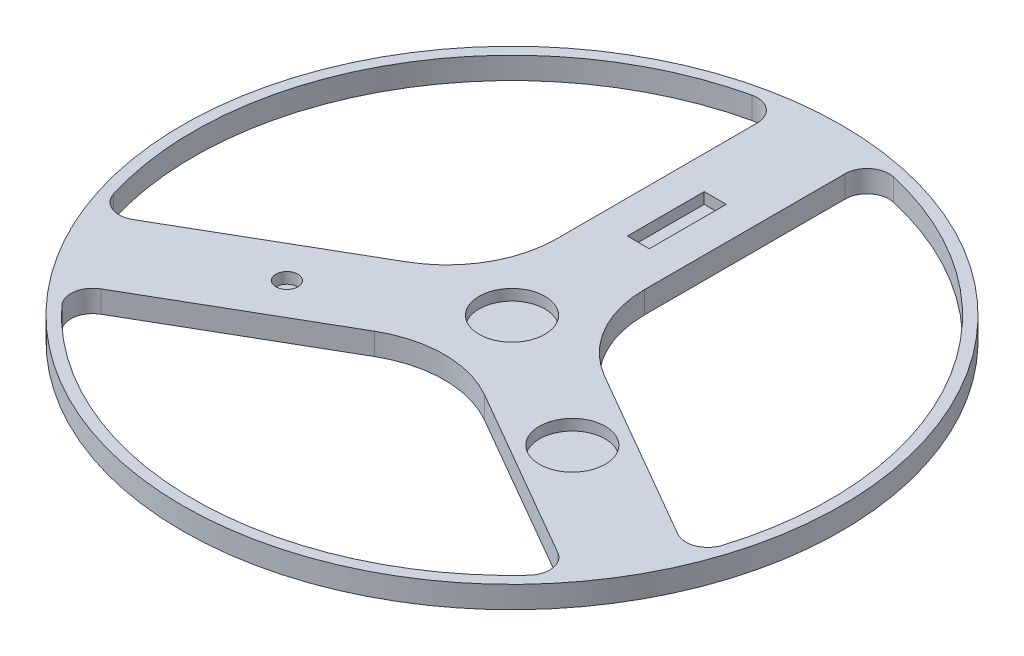
ISO-10303-21;
HEADER;
FILE_DESCRIPTION(('STEP AP214'),'2;1');
FILE_NAME('part.step','',(''),(''),'','','');
FILE_SCHEMA(('AUTOMOTIVE_DESIGN { 1 0 10303 214 1 1 1 1 }'));
ENDSEC;
DATA;
#1=APPLICATION_CONTEXT('core data for automotive mechanical design processes');
#2=APPLICATION_PROTOCOL_DEFINITION('international standard','automotive_design',2000,#1);
#3=PRODUCT_CONTEXT('',#1,'mechanical');
#4=PRODUCT('Part','Part','',(#3));
#5=PRODUCT_RELATED_PRODUCT_CATEGORY('part','',(#4));
#6=PRODUCT_DEFINITION_FORMATION('','',#4);
#7=PRODUCT_DEFINITION_CONTEXT('part definition',#1,'design');
#8=PRODUCT_DEFINITION('design','',#6,#7);
#9=PRODUCT_DEFINITION_SHAPE('','',#8);
#10=(LENGTH_UNIT() NAMED_UNIT(*) SI_UNIT(.MILLI.,.METRE.));
#11=(NAMED_UNIT(*) PLANE_ANGLE_UNIT() SI_UNIT($,.RADIAN.));
#12=(NAMED_UNIT(*) SI_UNIT($,.STERADIAN.) SOLID_ANGLE_UNIT());
#13=UNCERTAINTY_MEASURE_WITH_UNIT(LENGTH_MEASURE(1.E-05),#10,'distance_accuracy_value','');
#14=(GEOMETRIC_REPRESENTATION_CONTEXT(3) GLOBAL_UNCERTAINTY_ASSIGNED_CONTEXT((#13)) GLOBAL_UNIT_ASSIGNED_CONTEXT((#10,
#11,#12)) REPRESENTATION_CONTEXT('',''));
#15=CARTESIAN_POINT('',(0.,0.,0.));
#16=DIRECTION('',(0.,0.,1.));
#17=DIRECTION('',(1.,0.,0.));
#18=AXIS2_PLACEMENT_3D('',#15,#16,#17);
#19=CARTESIAN_POINT('',(-2.,2.,3.46410161513776));
#20=DIRECTION('',(-0.5,0.,0.866025403784439));
#21=DIRECTION('',(0.866025403784439,0.,0.5));
#22=AXIS2_PLACEMENT_3D('',#19,#20,#21);
#23=PLANE('',#22);
#24=DIRECTION('',(-0.866025403784439,0.,-0.5));
#25=VECTOR('',#24,1.);
#26=CARTESIAN_POINT('',(-2.,0.,3.46410161513776));
#27=LINE('',#26,#25);
#28=CARTESIAN_POINT('',(20.798026230356,0.,16.6265481962259));
#29=VERTEX_POINT('',#28);
#30=CARTESIAN_POINT('',(5.00000000000001,0.,7.50555349946514));
#31=VERTEX_POINT('',#30);
#32=EDGE_CURVE('E260',#29,#31,#27,.T.);
#33=ORIENTED_EDGE('',*,*,#32,.F.);
#34=DIRECTION('',(0.,1.,0.));
#35=VECTOR('',#34,1.);
#36=CARTESIAN_POINT('',(20.798026230356,2.,16.6265481962259));
#37=LINE('',#36,#35);
#38=CARTESIAN_POINT('',(20.798026230356,2.,16.6265481962259));
#39=VERTEX_POINT('',#38);
#40=EDGE_CURVE('E311',#29,#39,#37,.T.);
#41=ORIENTED_EDGE('',*,*,#40,.T.);
#42=DIRECTION('',(-0.866025403784439,0.,-0.5));
#43=VECTOR('',#42,1.);
#44=CARTESIAN_POINT('',(-2.,2.,3.46410161513776));
#45=LINE('',#44,#43);
#46=CARTESIAN_POINT('',(5.00000000000001,2.,7.50555349946514));
#47=VERTEX_POINT('',#46);
#48=EDGE_CURVE('E240',#39,#47,#45,.T.);
#49=ORIENTED_EDGE('',*,*,#48,.T.);
#50=DIRECTION('',(0.,-1.,0.));
#51=VECTOR('',#50,1.);
#52=CARTESIAN_POINT('',(5.00000000000001,2.,7.50555349946514));
#53=LINE('',#52,#51);
#54=EDGE_CURVE('E276',#47,#31,#53,.T.);
#55=ORIENTED_EDGE('',*,*,#54,.T.);
#56=EDGE_LOOP('',(#33,#41,#49,#55));
#57=FACE_BOUND('',#56,.T.);
#58=ADVANCED_FACE('F34',(#57),#23,.T.);
#59=CARTESIAN_POINT('',(0.,2.,0.));
#60=DIRECTION('',(0.,-1.,0.));
#61=DIRECTION('',(0.,0.,-1.));
#62=AXIS2_PLACEMENT_3D('',#59,#60,#61);
#63=CYLINDRICAL_SURFACE('',#62,29.);
#64=CARTESIAN_POINT('',(0.,2.,0.));
#65=DIRECTION('',(0.,1.,0.));
#66=DIRECTION('',(0.,0.,1.));
#67=AXIS2_PLACEMENT_3D('',#64,#65,#66);
#68=CIRCLE('',#67,29.);
#69=CARTESIAN_POINT('',(-21.2645466918638,2.,19.7184952262981));
#70=VERTEX_POINT('',#69);
#71=CARTESIAN_POINT('',(21.2645466918639,2.,19.7184952262981));
#72=VERTEX_POINT('',#71);
#73=EDGE_CURVE('E242',#70,#72,#68,.T.);
#74=ORIENTED_EDGE('',*,*,#73,.T.);
#75=DIRECTION('',(0.,-1.,0.));
#76=VECTOR('',#75,1.);
#77=CARTESIAN_POINT('',(21.2645466918639,2.,19.7184952262981));
#78=LINE('',#77,#76);
#79=CARTESIAN_POINT('',(21.2645466918639,0.,19.7184952262981));
#80=VERTEX_POINT('',#79);
#81=EDGE_CURVE('E308',#72,#80,#78,.T.);
#82=ORIENTED_EDGE('',*,*,#81,.T.);
#83=CARTESIAN_POINT('',(0.,0.,0.));
#84=DIRECTION('',(0.,1.,0.));
#85=DIRECTION('',(0.,0.,1.));
#86=AXIS2_PLACEMENT_3D('',#83,#84,#85);
#87=CIRCLE('',#86,29.);
#88=CARTESIAN_POINT('',(-21.2645466918638,0.,19.7184952262981));
#89=VERTEX_POINT('',#88);
#90=EDGE_CURVE('E262',#89,#80,#87,.T.);
#91=ORIENTED_EDGE('',*,*,#90,.F.);
#92=DIRECTION('',(0.,-1.,0.));
#93=VECTOR('',#92,1.);
#94=CARTESIAN_POINT('',(-21.2645466918638,2.,19.7184952262981));
#95=LINE('',#94,#93);
#96=EDGE_CURVE('E306',#89,#70,#95,.F.);
#97=ORIENTED_EDGE('',*,*,#96,.T.);
#98=EDGE_LOOP('',(#74,#82,#91,#97));
#99=FACE_BOUND('',#98,.T.);
#100=ADVANCED_FACE('F366',(#99),#63,.F.);
#101=CARTESIAN_POINT('',(-4.00000000000001,2.,0.));
#102=DIRECTION('',(1.,0.,0.));
#103=DIRECTION('',(0.,0.,-1.));
#104=AXIS2_PLACEMENT_3D('',#101,#102,#103);
#105=PLANE('',#104);
#106=DIRECTION('',(0.,0.,1.));
#107=VECTOR('',#106,1.);
#108=CARTESIAN_POINT('',(-4.00000000000001,2.,0.));
#109=LINE('',#108,#107);
#110=CARTESIAN_POINT('',(-4.,2.,-26.3248931621764));
#111=VERTEX_POINT('',#110);
#112=CARTESIAN_POINT('',(-4.,2.,-8.08290376865476));
#113=VERTEX_POINT('',#112);
#114=EDGE_CURVE('E243',#111,#113,#109,.T.);
#115=ORIENTED_EDGE('',*,*,#114,.F.);
#116=DIRECTION('',(0.,-1.,0.));
#117=VECTOR('',#116,1.);
#118=CARTESIAN_POINT('',(-4.,2.,-26.3248931621764));
#119=LINE('',#118,#117);
#120=CARTESIAN_POINT('',(-4.,0.,-26.3248931621764));
#121=VERTEX_POINT('',#120);
#122=EDGE_CURVE('E323',#111,#121,#119,.T.);
#123=ORIENTED_EDGE('',*,*,#122,.T.);
#124=DIRECTION('',(0.,0.,1.));
#125=VECTOR('',#124,1.);
#126=CARTESIAN_POINT('',(-4.00000000000001,0.,0.));
#127=LINE('',#126,#125);
#128=CARTESIAN_POINT('',(-4.,0.,-8.08290376865476));
#129=VERTEX_POINT('',#128);
#130=EDGE_CURVE('E263',#121,#129,#127,.T.);
#131=ORIENTED_EDGE('',*,*,#130,.T.);
#132=DIRECTION('',(0.,-1.,0.));
#133=VECTOR('',#132,1.);
#134=CARTESIAN_POINT('',(-4.,2.,-8.08290376865476));
#135=LINE('',#134,#133);
#136=EDGE_CURVE('E273',#129,#113,#135,.F.);
#137=ORIENTED_EDGE('',*,*,#136,.T.);
#138=EDGE_LOOP('',(#115,#123,#131,#137));
#139=FACE_BOUND('',#138,.T.);
#140=ADVANCED_FACE('F436',(#139),#105,.F.);
#141=CARTESIAN_POINT('',(-2.,2.,-3.46410161513776));
#142=DIRECTION('',(-0.500000000000001,0.,-0.866025403784438));
#143=DIRECTION('',(-0.866025403784438,0.,0.500000000000001));
#144=AXIS2_PLACEMENT_3D('',#141,#142,#143);
#145=PLANE('',#144);
#146=DIRECTION('',(0.866025403784438,0.,-0.500000000000001));
#147=VECTOR('',#146,1.);
#148=CARTESIAN_POINT('',(-2.,0.,-3.46410161513776));
#149=LINE('',#148,#147);
#150=CARTESIAN_POINT('',(-24.798026230356,0.,9.69834496595045));
#151=VERTEX_POINT('',#150);
#152=CARTESIAN_POINT('',(-9.,0.,0.577350269189626));
#153=VERTEX_POINT('',#152);
#154=EDGE_CURVE('E261',#151,#153,#149,.T.);
#155=ORIENTED_EDGE('',*,*,#154,.F.);
#156=DIRECTION('',(0.,1.,0.));
#157=VECTOR('',#156,1.);
#158=CARTESIAN_POINT('',(-24.798026230356,2.,9.69834496595044));
#159=LINE('',#158,#157);
#160=CARTESIAN_POINT('',(-24.798026230356,2.,9.69834496595045));
#161=VERTEX_POINT('',#160);
#162=EDGE_CURVE('E331',#151,#161,#159,.T.);
#163=ORIENTED_EDGE('',*,*,#162,.T.);
#164=DIRECTION('',(0.866025403784438,0.,-0.500000000000001));
#165=VECTOR('',#164,1.);
#166=CARTESIAN_POINT('',(-2.,2.,-3.46410161513776));
#167=LINE('',#166,#165);
#168=CARTESIAN_POINT('',(-9.,2.,0.577350269189626));
#169=VERTEX_POINT('',#168);
#170=EDGE_CURVE('E241',#161,#169,#167,.T.);
#171=ORIENTED_EDGE('',*,*,#170,.T.);
#172=DIRECTION('',(0.,-1.,0.));
#173=VECTOR('',#172,1.);
#174=CARTESIAN_POINT('',(-9.,2.,0.577350269189625));
#175=LINE('',#174,#173);
#176=EDGE_CURVE('E252',#169,#153,#175,.T.);
#177=ORIENTED_EDGE('',*,*,#176,.T.);
#178=EDGE_LOOP('',(#155,#163,#171,#177));
#179=FACE_BOUND('',#178,.T.);
#180=ADVANCED_FACE('F450',(#179),#145,.T.);
#181=CARTESIAN_POINT('',(2.,2.,-3.46410161513776));
#182=DIRECTION('',(-0.5,0.,0.866025403784439));
#183=DIRECTION('',(0.866025403784439,0.,0.5));
#184=AXIS2_PLACEMENT_3D('',#181,#182,#183);
#185=PLANE('',#184);
#186=DIRECTION('',(-0.866025403784439,0.,-0.5));
#187=VECTOR('',#186,1.);
#188=CARTESIAN_POINT('',(2.,2.,-3.46410161513776));
#189=LINE('',#188,#187);
#190=CARTESIAN_POINT('',(24.798026230356,2.,9.69834496595043));
#191=VERTEX_POINT('',#190);
#192=CARTESIAN_POINT('',(9.00000000000001,2.,0.577350269189624));
#193=VERTEX_POINT('',#192);
#194=EDGE_CURVE('E231',#191,#193,#189,.T.);
#195=ORIENTED_EDGE('',*,*,#194,.F.);
#196=DIRECTION('',(0.,-1.,0.));
#197=VECTOR('',#196,1.);
#198=CARTESIAN_POINT('',(24.798026230356,2.,9.69834496595042));
#199=LINE('',#198,#197);
#200=CARTESIAN_POINT('',(24.798026230356,0.,9.69834496595043));
#201=VERTEX_POINT('',#200);
#202=EDGE_CURVE('E313',#191,#201,#199,.T.);
#203=ORIENTED_EDGE('',*,*,#202,.T.);
#204=DIRECTION('',(-0.866025403784439,0.,-0.5));
#205=VECTOR('',#204,1.);
#206=CARTESIAN_POINT('',(2.,0.,-3.46410161513776));
#207=LINE('',#206,#205);
#208=CARTESIAN_POINT('',(9.00000000000001,0.,0.577350269189624));
#209=VERTEX_POINT('',#208);
#210=EDGE_CURVE('E226',#201,#209,#207,.T.);
#211=ORIENTED_EDGE('',*,*,#210,.T.);
#212=DIRECTION('',(0.,-1.,0.));
#213=VECTOR('',#212,1.);
#214=CARTESIAN_POINT('',(9.00000000000001,2.,0.577350269189622));
#215=LINE('',#214,#213);
#216=EDGE_CURVE('E285',#209,#193,#215,.F.);
#217=ORIENTED_EDGE('',*,*,#216,.T.);
#218=EDGE_LOOP('',(#195,#203,#211,#217));
#219=FACE_BOUND('',#218,.T.);
#220=ADVANCED_FACE('F414',(#219),#185,.F.);
#221=CARTESIAN_POINT('',(4.00000000000001,2.,0.));
#222=DIRECTION('',(1.,0.,0.));
#223=DIRECTION('',(0.,0.,-1.));
#224=AXIS2_PLACEMENT_3D('',#221,#222,#223);
#225=PLANE('',#224);
#226=DIRECTION('',(0.,0.,1.));
#227=VECTOR('',#226,1.);
#228=CARTESIAN_POINT('',(4.00000000000001,0.,0.));
#229=LINE('',#228,#227);
#230=CARTESIAN_POINT('',(4.,0.,-26.3248931621764));
#231=VERTEX_POINT('',#230);
#232=CARTESIAN_POINT('',(4.,0.,-8.08290376865476));
#233=VERTEX_POINT('',#232);
#234=EDGE_CURVE('E254',#231,#233,#229,.T.);
#235=ORIENTED_EDGE('',*,*,#234,.F.);
#236=DIRECTION('',(0.,1.,0.));
#237=VECTOR('',#236,1.);
#238=CARTESIAN_POINT('',(4.,2.,-26.3248931621764));
#239=LINE('',#238,#237);
#240=CARTESIAN_POINT('',(4.,2.,-26.3248931621764));
#241=VERTEX_POINT('',#240);
#242=EDGE_CURVE('E321',#231,#241,#239,.T.);
#243=ORIENTED_EDGE('',*,*,#242,.T.);
#244=DIRECTION('',(0.,0.,1.));
#245=VECTOR('',#244,1.);
#246=CARTESIAN_POINT('',(4.00000000000001,2.,0.));
#247=LINE('',#246,#245);
#248=CARTESIAN_POINT('',(4.,2.,-8.08290376865476));
#249=VERTEX_POINT('',#248);
#250=EDGE_CURVE('E233',#241,#249,#247,.T.);
#251=ORIENTED_EDGE('',*,*,#250,.T.);
#252=DIRECTION('',(0.,-1.,0.));
#253=VECTOR('',#252,1.);
#254=CARTESIAN_POINT('',(4.,2.,-8.08290376865476));
#255=LINE('',#254,#253);
#256=EDGE_CURVE('E282',#249,#233,#255,.T.);
#257=ORIENTED_EDGE('',*,*,#256,.T.);
#258=EDGE_LOOP('',(#235,#243,#251,#257));
#259=FACE_BOUND('',#258,.T.);
#260=ADVANCED_FACE('F405',(#259),#225,.T.);
#261=CARTESIAN_POINT('',(2.,2.,3.46410161513776));
#262=DIRECTION('',(-0.5,0.,-0.866025403784439));
#263=DIRECTION('',(-0.866025403784439,0.,0.5));
#264=AXIS2_PLACEMENT_3D('',#261,#262,#263);
#265=PLANE('',#264);
#266=DIRECTION('',(0.866025403784439,0.,-0.5));
#267=VECTOR('',#266,1.);
#268=CARTESIAN_POINT('',(2.,2.,3.46410161513776));
#269=LINE('',#268,#267);
#270=CARTESIAN_POINT('',(-20.798026230356,2.,16.626548196226));
#271=VERTEX_POINT('',#270);
#272=CARTESIAN_POINT('',(-4.99999999999999,2.,7.50555349946514));
#273=VERTEX_POINT('',#272);
#274=EDGE_CURVE('E247',#271,#273,#269,.T.);
#275=ORIENTED_EDGE('',*,*,#274,.F.);
#276=DIRECTION('',(0.,-1.,0.));
#277=VECTOR('',#276,1.);
#278=CARTESIAN_POINT('',(-20.798026230356,2.,16.626548196226));
#279=LINE('',#278,#277);
#280=CARTESIAN_POINT('',(-20.798026230356,0.,16.626548196226));
#281=VERTEX_POINT('',#280);
#282=EDGE_CURVE('E333',#271,#281,#279,.T.);
#283=ORIENTED_EDGE('',*,*,#282,.T.);
#284=DIRECTION('',(0.866025403784439,0.,-0.5));
#285=VECTOR('',#284,1.);
#286=CARTESIAN_POINT('',(2.,0.,3.46410161513776));
#287=LINE('',#286,#285);
#288=CARTESIAN_POINT('',(-4.99999999999999,0.,7.50555349946514));
#289=VERTEX_POINT('',#288);
#290=EDGE_CURVE('E267',#281,#289,#287,.T.);
#291=ORIENTED_EDGE('',*,*,#290,.T.);
#292=DIRECTION('',(0.,-1.,0.));
#293=VECTOR('',#292,1.);
#294=CARTESIAN_POINT('',(-4.99999999999999,2.,7.50555349946514));
#295=LINE('',#294,#293);
#296=EDGE_CURVE('E279',#289,#273,#295,.F.);
#297=ORIENTED_EDGE('',*,*,#296,.T.);
#298=EDGE_LOOP('',(#275,#283,#291,#297));
#299=FACE_BOUND('',#298,.T.);
#300=ADVANCED_FACE('F369',(#299),#265,.F.);
#301=CARTESIAN_POINT('',(-6.44444444444444,0.,-28.2748852482635));
#302=VERTEX_POINT('',#301);
#303=CARTESIAN_POINT('',(-27.7089911363083,0.,8.55639002196539));
#304=VERTEX_POINT('',#303);
#305=EDGE_CURVE('E257',#302,#304,#87,.T.);
#306=ORIENTED_EDGE('',*,*,#305,.F.);
#307=DIRECTION('',(0.,-1.,0.));
#308=VECTOR('',#307,1.);
#309=CARTESIAN_POINT('',(-6.44444444444444,2.,-28.2748852482635));
#310=LINE('',#309,#308);
#311=CARTESIAN_POINT('',(-6.44444444444444,2.,-28.2748852482635));
#312=VERTEX_POINT('',#311);
#313=EDGE_CURVE('E329',#302,#312,#310,.F.);
#314=ORIENTED_EDGE('',*,*,#313,.T.);
#315=CARTESIAN_POINT('',(-27.7089911363083,2.,8.55639002196539));
#316=VERTEX_POINT('',#315);
#317=EDGE_CURVE('E237',#312,#316,#68,.T.);
#318=ORIENTED_EDGE('',*,*,#317,.T.);
#319=DIRECTION('',(0.,-1.,0.));
#320=VECTOR('',#319,1.);
#321=CARTESIAN_POINT('',(-27.7089911363083,2.,8.55639002196539));
#322=LINE('',#321,#320);
#323=EDGE_CURVE('E326',#316,#304,#322,.T.);
#324=ORIENTED_EDGE('',*,*,#323,.T.);
#325=EDGE_LOOP('',(#306,#314,#318,#324));
#326=FACE_BOUND('',#325,.T.);
#327=ADVANCED_FACE('F449',(#326),#63,.F.);
#328=CARTESIAN_POINT('',(27.7089911363083,0.,8.55639002196537));
#329=VERTEX_POINT('',#328);
#330=CARTESIAN_POINT('',(6.44444444444444,0.,-28.2748852482635));
#331=VERTEX_POINT('',#330);
#332=EDGE_CURVE('E256',#329,#331,#87,.T.);
#333=ORIENTED_EDGE('',*,*,#332,.F.);
#334=DIRECTION('',(0.,-1.,0.));
#335=VECTOR('',#334,1.);
#336=CARTESIAN_POINT('',(27.7089911363083,2.,8.55639002196537));
#337=LINE('',#336,#335);
#338=CARTESIAN_POINT('',(27.7089911363083,2.,8.55639002196537));
#339=VERTEX_POINT('',#338);
#340=EDGE_CURVE('E319',#329,#339,#337,.F.);
#341=ORIENTED_EDGE('',*,*,#340,.T.);
#342=CARTESIAN_POINT('',(6.44444444444444,2.,-28.2748852482635));
#343=VERTEX_POINT('',#342);
#344=EDGE_CURVE('E236',#339,#343,#68,.T.);
#345=ORIENTED_EDGE('',*,*,#344,.T.);
#346=DIRECTION('',(0.,-1.,0.));
#347=VECTOR('',#346,1.);
#348=CARTESIAN_POINT('',(6.44444444444444,2.,-28.2748852482635));
#349=LINE('',#348,#347);
#350=EDGE_CURVE('E316',#343,#331,#349,.T.);
#351=ORIENTED_EDGE('',*,*,#350,.T.);
#352=EDGE_LOOP('',(#333,#341,#345,#351));
#353=FACE_BOUND('',#352,.T.);
#354=ADVANCED_FACE('F390',(#353),#63,.F.);
#355=CARTESIAN_POINT('',(0.,2.,0.));
#356=DIRECTION('',(0.,-1.,0.));
#357=DIRECTION('',(0.,0.,-1.));
#358=AXIS2_PLACEMENT_3D('',#355,#356,#357);
#359=CYLINDRICAL_SURFACE('',#358,30.);
#360=CARTESIAN_POINT('',(0.,2.,0.));
#361=DIRECTION('',(0.,1.,0.));
#362=DIRECTION('',(0.,0.,1.));
#363=AXIS2_PLACEMENT_3D('',#360,#361,#362);
#364=CIRCLE('',#363,30.);
#365=CARTESIAN_POINT('',(0.,2.,30.));
#366=VERTEX_POINT('',#365);
#367=EDGE_CURVE('E249',#366,#366,#364,.T.);
#368=ORIENTED_EDGE('',*,*,#367,.F.);
#369=EDGE_LOOP('',(#368));
#370=FACE_BOUND('',#369,.T.);
#371=CARTESIAN_POINT('',(0.,0.,0.));
#372=DIRECTION('',(0.,1.,0.));
#373=DIRECTION('',(0.,0.,1.));
#374=AXIS2_PLACEMENT_3D('',#371,#372,#373);
#375=CIRCLE('',#374,30.);
#376=CARTESIAN_POINT('',(0.,0.,30.));
#377=VERTEX_POINT('',#376);
#378=EDGE_CURVE('E234',#377,#377,#375,.T.);
#379=ORIENTED_EDGE('',*,*,#378,.T.);
#380=EDGE_LOOP('',(#379));
#381=FACE_BOUND('',#380,.T.);
#382=ADVANCED_FACE('F420',(#370,#381),#359,.T.);
#383=CARTESIAN_POINT('',(0.,2.,0.));
#384=DIRECTION('',(0.,1.,0.));
#385=DIRECTION('',(0.,0.,1.));
#386=AXIS2_PLACEMENT_3D('',#383,#384,#385);
#387=PLANE('',#386);
#388=CARTESIAN_POINT('',(-12.990200406743,2.,7.50031281672601));
#389=DIRECTION('',(0.,1.,0.));
#390=DIRECTION('',(0.,0.,1.));
#391=AXIS2_PLACEMENT_3D('',#388,#389,#390);
#392=CIRCLE('',#391,1.);
#393=CARTESIAN_POINT('',(-12.990200406743,2.,8.50031281672601));
#394=VERTEX_POINT('',#393);
#395=EDGE_CURVE('E514',#394,#394,#392,.T.);
#396=ORIENTED_EDGE('',*,*,#395,.F.);
#397=EDGE_LOOP('',(#396));
#398=FACE_BOUND('',#397,.T.);
#399=CARTESIAN_POINT('',(12.9900198245233,2.,7.49937432740137));
#400=DIRECTION('',(0.,1.,0.));
#401=DIRECTION('',(0.,0.,1.));
#402=AXIS2_PLACEMENT_3D('',#399,#400,#401);
#403=CIRCLE('',#402,3.);
#404=CARTESIAN_POINT('',(12.9900198245233,2.,10.4993743274014));
#405=VERTEX_POINT('',#404);
#406=EDGE_CURVE('E208',#405,#405,#403,.T.);
#407=ORIENTED_EDGE('',*,*,#406,.F.);
#408=EDGE_LOOP('',(#407));
#409=FACE_BOUND('',#408,.T.);
#410=DIRECTION('',(0.,0.,1.));
#411=VECTOR('',#410,1.);
#412=CARTESIAN_POINT('',(-1.00036123224324,2.,-11.5006256725986));
#413=LINE('',#412,#411);
#414=CARTESIAN_POINT('',(-1.00036123224324,2.,-18.5006256725986));
#415=VERTEX_POINT('',#414);
#416=CARTESIAN_POINT('',(-1.00036123224324,2.,-11.5006256725986));
#417=VERTEX_POINT('',#416);
#418=EDGE_CURVE('E49',#415,#417,#413,.T.);
#419=ORIENTED_EDGE('',*,*,#418,.F.);
#420=DIRECTION('',(-1.,0.,0.));
#421=VECTOR('',#420,1.);
#422=CARTESIAN_POINT('',(0.999638767756755,2.,-18.5006256725986));
#423=LINE('',#422,#421);
#424=CARTESIAN_POINT('',(0.999638767756755,2.,-18.5006256725986));
#425=VERTEX_POINT('',#424);
#426=EDGE_CURVE('E202',#425,#415,#423,.T.);
#427=ORIENTED_EDGE('',*,*,#426,.F.);
#428=DIRECTION('',(0.,0.,-1.));
#429=VECTOR('',#428,1.);
#430=CARTESIAN_POINT('',(0.999638767756755,2.,-11.5006256725986));
#431=LINE('',#430,#429);
#432=CARTESIAN_POINT('',(0.999638767756755,2.,-11.5006256725986));
#433=VERTEX_POINT('',#432);
#434=EDGE_CURVE('E205',#433,#425,#431,.T.);
#435=ORIENTED_EDGE('',*,*,#434,.F.);
#436=DIRECTION('',(1.,0.,0.));
#437=VECTOR('',#436,1.);
#438=CARTESIAN_POINT('',(0.999638767756755,2.,-11.5006256725986));
#439=LINE('',#438,#437);
#440=EDGE_CURVE('E214',#417,#433,#439,.T.);
#441=ORIENTED_EDGE('',*,*,#440,.F.);
#442=EDGE_LOOP('',(#419,#427,#435,#441));
#443=FACE_BOUND('',#442,.T.);
#444=CARTESIAN_POINT('',(0.,2.,0.));
#445=DIRECTION('',(0.,1.,0.));
#446=DIRECTION('',(0.,0.,1.));
#447=AXIS2_PLACEMENT_3D('',#444,#445,#446);
#448=CIRCLE('',#447,3.);
#449=CARTESIAN_POINT('',(0.,2.,3.));
#450=VERTEX_POINT('',#449);
#451=EDGE_CURVE('E227',#450,#450,#448,.T.);
#452=ORIENTED_EDGE('',*,*,#451,.F.);
#453=EDGE_LOOP('',(#452));
#454=FACE_BOUND('',#453,.T.);
#455=ORIENTED_EDGE('',*,*,#344,.F.);
#456=CARTESIAN_POINT('',(25.798026230356,2.,7.96629415838155));
#457=DIRECTION('',(0.,1.,0.));
#458=DIRECTION('',(0.,0.,1.));
#459=AXIS2_PLACEMENT_3D('',#456,#457,#458);
#460=CIRCLE('',#459,2.);
#461=EDGE_CURVE('E342',#339,#191,#460,.F.);
#462=ORIENTED_EDGE('',*,*,#461,.T.);
#463=ORIENTED_EDGE('',*,*,#194,.T.);
#464=CARTESIAN_POINT('',(14.,2.,-8.08290376865476));
#465=DIRECTION('',(0.,1.,0.));
#466=DIRECTION('',(0.,0.,1.));
#467=AXIS2_PLACEMENT_3D('',#464,#465,#466);
#468=CIRCLE('',#467,10.);
#469=EDGE_CURVE('E303',#193,#249,#468,.F.);
#470=ORIENTED_EDGE('',*,*,#469,.T.);
#471=ORIENTED_EDGE('',*,*,#250,.F.);
#472=CARTESIAN_POINT('',(6.,2.,-26.3248931621764));
#473=DIRECTION('',(0.,1.,0.));
#474=DIRECTION('',(0.,0.,1.));
#475=AXIS2_PLACEMENT_3D('',#472,#473,#474);
#476=CIRCLE('',#475,2.);
#477=EDGE_CURVE('E346',#241,#343,#476,.F.);
#478=ORIENTED_EDGE('',*,*,#477,.T.);
#479=EDGE_LOOP('',(#455,#462,#463,#470,#471,#478));
#480=FACE_BOUND('',#479,.T.);
#481=ORIENTED_EDGE('',*,*,#317,.F.);
#482=CARTESIAN_POINT('',(-6.,2.,-26.3248931621764));
#483=DIRECTION('',(0.,1.,0.));
#484=DIRECTION('',(0.,0.,1.));
#485=AXIS2_PLACEMENT_3D('',#482,#483,#484);
#486=CIRCLE('',#485,2.);
#487=EDGE_CURVE('E350',#312,#111,#486,.F.);
#488=ORIENTED_EDGE('',*,*,#487,.T.);
#489=ORIENTED_EDGE('',*,*,#114,.T.);
#490=CARTESIAN_POINT('',(-14.,2.,-8.08290376865476));
#491=DIRECTION('',(0.,1.,0.));
#492=DIRECTION('',(0.,0.,1.));
#493=AXIS2_PLACEMENT_3D('',#490,#491,#492);
#494=CIRCLE('',#493,10.);
#495=EDGE_CURVE('E291',#113,#169,#494,.F.);
#496=ORIENTED_EDGE('',*,*,#495,.T.);
#497=ORIENTED_EDGE('',*,*,#170,.F.);
#498=CARTESIAN_POINT('',(-25.798026230356,2.,7.96629415838157));
#499=DIRECTION('',(0.,1.,0.));
#500=DIRECTION('',(0.,0.,1.));
#501=AXIS2_PLACEMENT_3D('',#498,#499,#500);
#502=CIRCLE('',#501,2.);
#503=EDGE_CURVE('E354',#161,#316,#502,.F.);
#504=ORIENTED_EDGE('',*,*,#503,.T.);
#505=EDGE_LOOP('',(#481,#488,#489,#496,#497,#504));
#506=FACE_BOUND('',#505,.T.);
#507=ORIENTED_EDGE('',*,*,#48,.F.);
#508=CARTESIAN_POINT('',(19.798026230356,2.,18.3585990037948));
#509=DIRECTION('',(0.,1.,0.));
#510=DIRECTION('',(0.,0.,1.));
#511=AXIS2_PLACEMENT_3D('',#508,#509,#510);
#512=CIRCLE('',#511,2.);
#513=EDGE_CURVE('E338',#39,#72,#512,.F.);
#514=ORIENTED_EDGE('',*,*,#513,.T.);
#515=ORIENTED_EDGE('',*,*,#73,.F.);
#516=CARTESIAN_POINT('',(-19.798026230356,2.,18.3585990037948));
#517=DIRECTION('',(0.,1.,0.));
#518=DIRECTION('',(0.,0.,1.));
#519=AXIS2_PLACEMENT_3D('',#516,#517,#518);
#520=CIRCLE('',#519,2.);
#521=EDGE_CURVE('E11',#70,#271,#520,.F.);
#522=ORIENTED_EDGE('',*,*,#521,.T.);
#523=ORIENTED_EDGE('',*,*,#274,.T.);
#524=CARTESIAN_POINT('',(0.,2.,16.1658075373095));
#525=DIRECTION('',(0.,1.,0.));
#526=DIRECTION('',(0.,0.,1.));
#527=AXIS2_PLACEMENT_3D('',#524,#525,#526);
#528=CIRCLE('',#527,10.);
#529=EDGE_CURVE('E297',#273,#47,#528,.F.);
#530=ORIENTED_EDGE('',*,*,#529,.T.);
#531=EDGE_LOOP('',(#507,#514,#515,#522,#523,#530));
#532=FACE_BOUND('',#531,.T.);
#533=ORIENTED_EDGE('',*,*,#367,.T.);
#534=EDGE_LOOP('',(#533));
#535=FACE_BOUND('',#534,.T.);
#536=ADVANCED_FACE('F373',(#398,#409,#443,#454,#480,#506,#532,#535),#387,.T.);
#537=CARTESIAN_POINT('',(0.,0.,0.));
#538=DIRECTION('',(0.,1.,0.));
#539=DIRECTION('',(0.,0.,1.));
#540=AXIS2_PLACEMENT_3D('',#537,#538,#539);
#541=PLANE('',#540);
#542=ORIENTED_EDGE('',*,*,#210,.F.);
#543=CARTESIAN_POINT('',(25.798026230356,0.,7.96629415838155));
#544=DIRECTION('',(0.,1.,0.));
#545=DIRECTION('',(0.,0.,1.));
#546=AXIS2_PLACEMENT_3D('',#543,#544,#545);
#547=CIRCLE('',#546,2.);
#548=EDGE_CURVE('E340',#201,#329,#547,.T.);
#549=ORIENTED_EDGE('',*,*,#548,.T.);
#550=ORIENTED_EDGE('',*,*,#332,.T.);
#551=CARTESIAN_POINT('',(6.,0.,-26.3248931621764));
#552=DIRECTION('',(0.,1.,0.));
#553=DIRECTION('',(0.,0.,1.));
#554=AXIS2_PLACEMENT_3D('',#551,#552,#553);
#555=CIRCLE('',#554,2.);
#556=EDGE_CURVE('E344',#331,#231,#555,.T.);
#557=ORIENTED_EDGE('',*,*,#556,.T.);
#558=ORIENTED_EDGE('',*,*,#234,.T.);
#559=CARTESIAN_POINT('',(14.,0.,-8.08290376865476));
#560=DIRECTION('',(0.,1.,0.));
#561=DIRECTION('',(0.,0.,1.));
#562=AXIS2_PLACEMENT_3D('',#559,#560,#561);
#563=CIRCLE('',#562,10.);
#564=EDGE_CURVE('E300',#233,#209,#563,.T.);
#565=ORIENTED_EDGE('',*,*,#564,.T.);
#566=EDGE_LOOP('',(#542,#549,#550,#557,#558,#565));
#567=FACE_BOUND('',#566,.T.);
#568=ORIENTED_EDGE('',*,*,#130,.F.);
#569=CARTESIAN_POINT('',(-6.,0.,-26.3248931621764));
#570=DIRECTION('',(0.,1.,0.));
#571=DIRECTION('',(0.,0.,1.));
#572=AXIS2_PLACEMENT_3D('',#569,#570,#571);
#573=CIRCLE('',#572,2.);
#574=EDGE_CURVE('E348',#121,#302,#573,.T.);
#575=ORIENTED_EDGE('',*,*,#574,.T.);
#576=ORIENTED_EDGE('',*,*,#305,.T.);
#577=CARTESIAN_POINT('',(-25.798026230356,0.,7.96629415838157));
#578=DIRECTION('',(0.,1.,0.));
#579=DIRECTION('',(0.,0.,1.));
#580=AXIS2_PLACEMENT_3D('',#577,#578,#579);
#581=CIRCLE('',#580,2.);
#582=EDGE_CURVE('E352',#304,#151,#581,.T.);
#583=ORIENTED_EDGE('',*,*,#582,.T.);
#584=ORIENTED_EDGE('',*,*,#154,.T.);
#585=CARTESIAN_POINT('',(-14.,0.,-8.08290376865476));
#586=DIRECTION('',(0.,1.,0.));
#587=DIRECTION('',(0.,0.,1.));
#588=AXIS2_PLACEMENT_3D('',#585,#586,#587);
#589=CIRCLE('',#588,10.);
#590=EDGE_CURVE('E288',#153,#129,#589,.T.);
#591=ORIENTED_EDGE('',*,*,#590,.T.);
#592=EDGE_LOOP('',(#568,#575,#576,#583,#584,#591));
#593=FACE_BOUND('',#592,.T.);
#594=ORIENTED_EDGE('',*,*,#90,.T.);
#595=CARTESIAN_POINT('',(19.798026230356,0.,18.3585990037948));
#596=DIRECTION('',(0.,1.,0.));
#597=DIRECTION('',(0.,0.,1.));
#598=AXIS2_PLACEMENT_3D('',#595,#596,#597);
#599=CIRCLE('',#598,2.);
#600=EDGE_CURVE('E336',#80,#29,#599,.T.);
#601=ORIENTED_EDGE('',*,*,#600,.T.);
#602=ORIENTED_EDGE('',*,*,#32,.T.);
#603=CARTESIAN_POINT('',(0.,0.,16.1658075373095));
#604=DIRECTION('',(0.,1.,0.));
#605=DIRECTION('',(0.,0.,1.));
#606=AXIS2_PLACEMENT_3D('',#603,#604,#605);
#607=CIRCLE('',#606,10.);
#608=EDGE_CURVE('E294',#31,#289,#607,.T.);
#609=ORIENTED_EDGE('',*,*,#608,.T.);
#610=ORIENTED_EDGE('',*,*,#290,.F.);
#611=CARTESIAN_POINT('',(-19.798026230356,0.,18.3585990037948));
#612=DIRECTION('',(0.,1.,0.));
#613=DIRECTION('',(0.,0.,1.));
#614=AXIS2_PLACEMENT_3D('',#611,#612,#613);
#615=CIRCLE('',#614,2.);
#616=EDGE_CURVE('E42',#281,#89,#615,.T.);
#617=ORIENTED_EDGE('',*,*,#616,.T.);
#618=EDGE_LOOP('',(#594,#601,#602,#609,#610,#617));
#619=FACE_BOUND('',#618,.T.);
#620=ORIENTED_EDGE('',*,*,#378,.F.);
#621=EDGE_LOOP('',(#620));
#622=FACE_BOUND('',#621,.T.);
#623=ADVANCED_FACE('F359',(#567,#593,#619,#622),#541,.F.);
#624=CARTESIAN_POINT('',(-14.,2.,-8.08290376865476));
#625=DIRECTION('',(0.,-1.,0.));
#626=DIRECTION('',(0.,0.,-1.));
#627=AXIS2_PLACEMENT_3D('',#624,#625,#626);
#628=CYLINDRICAL_SURFACE('',#627,10.);
#629=ORIENTED_EDGE('',*,*,#495,.F.);
#630=ORIENTED_EDGE('',*,*,#136,.F.);
#631=ORIENTED_EDGE('',*,*,#590,.F.);
#632=ORIENTED_EDGE('',*,*,#176,.F.);
#633=EDGE_LOOP('',(#629,#630,#631,#632));
#634=FACE_BOUND('',#633,.T.);
#635=ADVANCED_FACE('F444',(#634),#628,.F.);
#636=CARTESIAN_POINT('',(0.,2.,16.1658075373095));
#637=DIRECTION('',(0.,-1.,0.));
#638=DIRECTION('',(0.,0.,-1.));
#639=AXIS2_PLACEMENT_3D('',#636,#637,#638);
#640=CYLINDRICAL_SURFACE('',#639,10.);
#641=ORIENTED_EDGE('',*,*,#529,.F.);
#642=ORIENTED_EDGE('',*,*,#296,.F.);
#643=ORIENTED_EDGE('',*,*,#608,.F.);
#644=ORIENTED_EDGE('',*,*,#54,.F.);
#645=EDGE_LOOP('',(#641,#642,#643,#644));
#646=FACE_BOUND('',#645,.T.);
#647=ADVANCED_FACE('F379',(#646),#640,.F.);
#648=CARTESIAN_POINT('',(14.,2.,-8.08290376865476));
#649=DIRECTION('',(0.,-1.,0.));
#650=DIRECTION('',(0.,0.,-1.));
#651=AXIS2_PLACEMENT_3D('',#648,#649,#650);
#652=CYLINDRICAL_SURFACE('',#651,10.);
#653=ORIENTED_EDGE('',*,*,#469,.F.);
#654=ORIENTED_EDGE('',*,*,#216,.F.);
#655=ORIENTED_EDGE('',*,*,#564,.F.);
#656=ORIENTED_EDGE('',*,*,#256,.F.);
#657=EDGE_LOOP('',(#653,#654,#655,#656));
#658=FACE_BOUND('',#657,.T.);
#659=ADVANCED_FACE('F410',(#658),#652,.F.);
#660=CARTESIAN_POINT('',(19.798026230356,2.,18.3585990037948));
#661=DIRECTION('',(0.,-1.,0.));
#662=DIRECTION('',(0.,0.,-1.));
#663=AXIS2_PLACEMENT_3D('',#660,#661,#662);
#664=CYLINDRICAL_SURFACE('',#663,2.);
#665=ORIENTED_EDGE('',*,*,#513,.F.);
#666=ORIENTED_EDGE('',*,*,#40,.F.);
#667=ORIENTED_EDGE('',*,*,#600,.F.);
#668=ORIENTED_EDGE('',*,*,#81,.F.);
#669=EDGE_LOOP('',(#665,#666,#667,#668));
#670=FACE_BOUND('',#669,.T.);
#671=ADVANCED_FACE('F384',(#670),#664,.F.);
#672=CARTESIAN_POINT('',(25.798026230356,2.,7.96629415838155));
#673=DIRECTION('',(0.,-1.,0.));
#674=DIRECTION('',(0.,0.,-1.));
#675=AXIS2_PLACEMENT_3D('',#672,#673,#674);
#676=CYLINDRICAL_SURFACE('',#675,2.);
#677=ORIENTED_EDGE('',*,*,#461,.F.);
#678=ORIENTED_EDGE('',*,*,#340,.F.);
#679=ORIENTED_EDGE('',*,*,#548,.F.);
#680=ORIENTED_EDGE('',*,*,#202,.F.);
#681=EDGE_LOOP('',(#677,#678,#679,#680));
#682=FACE_BOUND('',#681,.T.);
#683=ADVANCED_FACE('F417',(#682),#676,.F.);
#684=CARTESIAN_POINT('',(6.,2.,-26.3248931621764));
#685=DIRECTION('',(0.,-1.,0.));
#686=DIRECTION('',(0.,0.,-1.));
#687=AXIS2_PLACEMENT_3D('',#684,#685,#686);
#688=CYLINDRICAL_SURFACE('',#687,2.);
#689=ORIENTED_EDGE('',*,*,#477,.F.);
#690=ORIENTED_EDGE('',*,*,#242,.F.);
#691=ORIENTED_EDGE('',*,*,#556,.F.);
#692=ORIENTED_EDGE('',*,*,#350,.F.);
#693=EDGE_LOOP('',(#689,#690,#691,#692));
#694=FACE_BOUND('',#693,.T.);
#695=ADVANCED_FACE('F397',(#694),#688,.F.);
#696=CARTESIAN_POINT('',(-6.,2.,-26.3248931621764));
#697=DIRECTION('',(0.,-1.,0.));
#698=DIRECTION('',(0.,0.,-1.));
#699=AXIS2_PLACEMENT_3D('',#696,#697,#698);
#700=CYLINDRICAL_SURFACE('',#699,2.);
#701=ORIENTED_EDGE('',*,*,#487,.F.);
#702=ORIENTED_EDGE('',*,*,#313,.F.);
#703=ORIENTED_EDGE('',*,*,#574,.F.);
#704=ORIENTED_EDGE('',*,*,#122,.F.);
#705=EDGE_LOOP('',(#701,#702,#703,#704));
#706=FACE_BOUND('',#705,.T.);
#707=ADVANCED_FACE('F433',(#706),#700,.F.);
#708=CARTESIAN_POINT('',(-25.798026230356,2.,7.96629415838157));
#709=DIRECTION('',(0.,-1.,0.));
#710=DIRECTION('',(0.,0.,-1.));
#711=AXIS2_PLACEMENT_3D('',#708,#709,#710);
#712=CYLINDRICAL_SURFACE('',#711,2.);
#713=ORIENTED_EDGE('',*,*,#503,.F.);
#714=ORIENTED_EDGE('',*,*,#162,.F.);
#715=ORIENTED_EDGE('',*,*,#582,.F.);
#716=ORIENTED_EDGE('',*,*,#323,.F.);
#717=EDGE_LOOP('',(#713,#714,#715,#716));
#718=FACE_BOUND('',#717,.T.);
#719=ADVANCED_FACE('F448',(#718),#712,.F.);
#720=CARTESIAN_POINT('',(-19.798026230356,2.,18.3585990037948));
#721=DIRECTION('',(0.,-1.,0.));
#722=DIRECTION('',(0.,0.,-1.));
#723=AXIS2_PLACEMENT_3D('',#720,#721,#722);
#724=CYLINDRICAL_SURFACE('',#723,2.);
#725=ORIENTED_EDGE('',*,*,#521,.F.);
#726=ORIENTED_EDGE('',*,*,#96,.F.);
#727=ORIENTED_EDGE('',*,*,#616,.F.);
#728=ORIENTED_EDGE('',*,*,#282,.F.);
#729=EDGE_LOOP('',(#725,#726,#727,#728));
#730=FACE_BOUND('',#729,.T.);
#731=ADVANCED_FACE('F36',(#730),#724,.F.);
#732=CARTESIAN_POINT('',(0.,1.,0.));
#733=DIRECTION('',(0.,1.,0.));
#734=DIRECTION('',(0.,0.,1.));
#735=AXIS2_PLACEMENT_3D('',#732,#733,#734);
#736=CYLINDRICAL_SURFACE('',#735,3.);
#737=CARTESIAN_POINT('',(0.,1.,0.));
#738=DIRECTION('',(0.,1.,0.));
#739=DIRECTION('',(0.,0.,1.));
#740=AXIS2_PLACEMENT_3D('',#737,#738,#739);
#741=CIRCLE('',#740,3.);
#742=CARTESIAN_POINT('',(0.,1.,3.));
#743=VERTEX_POINT('',#742);
#744=EDGE_CURVE('E223',#743,#743,#741,.T.);
#745=ORIENTED_EDGE('',*,*,#744,.F.);
#746=EDGE_LOOP('',(#745));
#747=FACE_BOUND('',#746,.T.);
#748=ORIENTED_EDGE('',*,*,#451,.T.);
#749=EDGE_LOOP('',(#748));
#750=FACE_BOUND('',#749,.T.);
#751=ADVANCED_FACE('F473',(#747,#750),#736,.F.);
#752=CARTESIAN_POINT('',(0.,1.,0.));
#753=DIRECTION('',(0.,1.,0.));
#754=DIRECTION('',(0.,0.,1.));
#755=AXIS2_PLACEMENT_3D('',#752,#753,#754);
#756=PLANE('',#755);
#757=ORIENTED_EDGE('',*,*,#744,.T.);
#758=EDGE_LOOP('',(#757));
#759=FACE_BOUND('',#758,.T.);
#760=ADVANCED_FACE('F476',(#759),#756,.T.);
#761=CARTESIAN_POINT('',(-1.00036123224324,1.,-11.5006256725986));
#762=DIRECTION('',(-1.,0.,0.));
#763=DIRECTION('',(0.,0.,1.));
#764=AXIS2_PLACEMENT_3D('',#761,#762,#763);
#765=PLANE('',#764);
#766=ORIENTED_EDGE('',*,*,#418,.T.);
#767=DIRECTION('',(0.,1.,0.));
#768=VECTOR('',#767,1.);
#769=CARTESIAN_POINT('',(-1.00036123224324,1.,-11.5006256725986));
#770=LINE('',#769,#768);
#771=CARTESIAN_POINT('',(-1.00036123224324,1.,-11.5006256725986));
#772=VERTEX_POINT('',#771);
#773=EDGE_CURVE('E180',#772,#417,#770,.T.);
#774=ORIENTED_EDGE('',*,*,#773,.F.);
#775=DIRECTION('',(0.,0.,1.));
#776=VECTOR('',#775,1.);
#777=CARTESIAN_POINT('',(-1.00036123224324,1.,-11.5006256725986));
#778=LINE('',#777,#776);
#779=CARTESIAN_POINT('',(-1.00036123224324,1.,-18.5006256725986));
#780=VERTEX_POINT('',#779);
#781=EDGE_CURVE('E184',#780,#772,#778,.T.);
#782=ORIENTED_EDGE('',*,*,#781,.F.);
#783=DIRECTION('',(0.,1.,0.));
#784=VECTOR('',#783,1.);
#785=CARTESIAN_POINT('',(-1.00036123224324,1.,-18.5006256725986));
#786=LINE('',#785,#784);
#787=EDGE_CURVE('E218',#780,#415,#786,.T.);
#788=ORIENTED_EDGE('',*,*,#787,.T.);
#789=EDGE_LOOP('',(#766,#774,#782,#788));
#790=FACE_BOUND('',#789,.T.);
#791=ADVANCED_FACE('F182',(#790),#765,.F.);
#792=CARTESIAN_POINT('',(0.999638767756755,1.,-18.5006256725986));
#793=DIRECTION('',(0.,0.,-1.));
#794=DIRECTION('',(-1.,0.,0.));
#795=AXIS2_PLACEMENT_3D('',#792,#793,#794);
#796=PLANE('',#795);
#797=ORIENTED_EDGE('',*,*,#426,.T.);
#798=ORIENTED_EDGE('',*,*,#787,.F.);
#799=DIRECTION('',(-1.,0.,0.));
#800=VECTOR('',#799,1.);
#801=CARTESIAN_POINT('',(0.999638767756755,1.,-18.5006256725986));
#802=LINE('',#801,#800);
#803=CARTESIAN_POINT('',(0.999638767756755,1.,-18.5006256725986));
#804=VERTEX_POINT('',#803);
#805=EDGE_CURVE('E190',#804,#780,#802,.T.);
#806=ORIENTED_EDGE('',*,*,#805,.F.);
#807=DIRECTION('',(0.,1.,0.));
#808=VECTOR('',#807,1.);
#809=CARTESIAN_POINT('',(0.999638767756755,1.,-18.5006256725986));
#810=LINE('',#809,#808);
#811=EDGE_CURVE('E220',#804,#425,#810,.T.);
#812=ORIENTED_EDGE('',*,*,#811,.T.);
#813=EDGE_LOOP('',(#797,#798,#806,#812));
#814=FACE_BOUND('',#813,.T.);
#815=ADVANCED_FACE('F483',(#814),#796,.F.);
#816=CARTESIAN_POINT('',(0.999638767756755,1.,-11.5006256725986));
#817=DIRECTION('',(1.,0.,0.));
#818=DIRECTION('',(0.,0.,-1.));
#819=AXIS2_PLACEMENT_3D('',#816,#817,#818);
#820=PLANE('',#819);
#821=ORIENTED_EDGE('',*,*,#434,.T.);
#822=ORIENTED_EDGE('',*,*,#811,.F.);
#823=DIRECTION('',(0.,0.,-1.));
#824=VECTOR('',#823,1.);
#825=CARTESIAN_POINT('',(0.999638767756755,1.,-11.5006256725986));
#826=LINE('',#825,#824);
#827=CARTESIAN_POINT('',(0.999638767756755,1.,-11.5006256725986));
#828=VERTEX_POINT('',#827);
#829=EDGE_CURVE('E198',#828,#804,#826,.T.);
#830=ORIENTED_EDGE('',*,*,#829,.F.);
#831=DIRECTION('',(0.,1.,0.));
#832=VECTOR('',#831,1.);
#833=CARTESIAN_POINT('',(0.999638767756755,1.,-11.5006256725986));
#834=LINE('',#833,#832);
#835=EDGE_CURVE('E189',#828,#433,#834,.T.);
#836=ORIENTED_EDGE('',*,*,#835,.T.);
#837=EDGE_LOOP('',(#821,#822,#830,#836));
#838=FACE_BOUND('',#837,.T.);
#839=ADVANCED_FACE('F486',(#838),#820,.F.);
#840=CARTESIAN_POINT('',(0.999638767756755,1.,-11.5006256725986));
#841=DIRECTION('',(0.,0.,1.));
#842=DIRECTION('',(1.,0.,0.));
#843=AXIS2_PLACEMENT_3D('',#840,#841,#842);
#844=PLANE('',#843);
#845=ORIENTED_EDGE('',*,*,#440,.T.);
#846=ORIENTED_EDGE('',*,*,#835,.F.);
#847=DIRECTION('',(1.,0.,0.));
#848=VECTOR('',#847,1.);
#849=CARTESIAN_POINT('',(0.999638767756755,1.,-11.5006256725986));
#850=LINE('',#849,#848);
#851=EDGE_CURVE('E193',#772,#828,#850,.T.);
#852=ORIENTED_EDGE('',*,*,#851,.F.);
#853=ORIENTED_EDGE('',*,*,#773,.T.);
#854=EDGE_LOOP('',(#845,#846,#852,#853));
#855=FACE_BOUND('',#854,.T.);
#856=ADVANCED_FACE('F194',(#855),#844,.F.);
#857=CARTESIAN_POINT('',(0.,1.,0.));
#858=DIRECTION('',(0.,1.,0.));
#859=DIRECTION('',(0.,0.,1.));
#860=AXIS2_PLACEMENT_3D('',#857,#858,#859);
#861=PLANE('',#860);
#862=ORIENTED_EDGE('',*,*,#781,.T.);
#863=ORIENTED_EDGE('',*,*,#851,.T.);
#864=ORIENTED_EDGE('',*,*,#829,.T.);
#865=ORIENTED_EDGE('',*,*,#805,.T.);
#866=EDGE_LOOP('',(#862,#863,#864,#865));
#867=FACE_BOUND('',#866,.T.);
#868=ADVANCED_FACE('F200',(#867),#861,.T.);
#869=CARTESIAN_POINT('',(12.9900198245233,1.,7.49937432740137));
#870=DIRECTION('',(0.,1.,0.));
#871=DIRECTION('',(0.,0.,1.));
#872=AXIS2_PLACEMENT_3D('',#869,#870,#871);
#873=CYLINDRICAL_SURFACE('',#872,3.);
#874=CARTESIAN_POINT('',(12.9900198245233,1.,7.49937432740137));
#875=DIRECTION('',(0.,1.,0.));
#876=DIRECTION('',(0.,0.,1.));
#877=AXIS2_PLACEMENT_3D('',#874,#875,#876);
#878=CIRCLE('',#877,3.);
#879=CARTESIAN_POINT('',(12.9900198245233,1.,10.4993743274014));
#880=VERTEX_POINT('',#879);
#881=EDGE_CURVE('E517',#880,#880,#878,.T.);
#882=ORIENTED_EDGE('',*,*,#881,.F.);
#883=EDGE_LOOP('',(#882));
#884=FACE_BOUND('',#883,.T.);
#885=ORIENTED_EDGE('',*,*,#406,.T.);
#886=EDGE_LOOP('',(#885));
#887=FACE_BOUND('',#886,.T.);
#888=ADVANCED_FACE('F495',(#884,#887),#873,.F.);
#889=CARTESIAN_POINT('',(12.9900198245233,1.,7.49937432740137));
#890=DIRECTION('',(0.,1.,0.));
#891=DIRECTION('',(0.,0.,1.));
#892=AXIS2_PLACEMENT_3D('',#889,#890,#891);
#893=PLANE('',#892);
#894=ORIENTED_EDGE('',*,*,#881,.T.);
#895=EDGE_LOOP('',(#894));
#896=FACE_BOUND('',#895,.T.);
#897=ADVANCED_FACE('F498',(#896),#893,.T.);
#898=CARTESIAN_POINT('',(-12.990200406743,1.,7.50031281672601));
#899=DIRECTION('',(0.,1.,0.));
#900=DIRECTION('',(0.,0.,1.));
#901=AXIS2_PLACEMENT_3D('',#898,#899,#900);
#902=CYLINDRICAL_SURFACE('',#901,1.);
#903=CARTESIAN_POINT('',(-12.990200406743,1.,7.50031281672601));
#904=DIRECTION('',(0.,1.,0.));
#905=DIRECTION('',(0.,0.,1.));
#906=AXIS2_PLACEMENT_3D('',#903,#904,#905);
#907=CIRCLE('',#906,1.);
#908=CARTESIAN_POINT('',(-12.990200406743,1.,8.50031281672601));
#909=VERTEX_POINT('',#908);
#910=EDGE_CURVE('E230',#909,#909,#907,.T.);
#911=ORIENTED_EDGE('',*,*,#910,.F.);
#912=EDGE_LOOP('',(#911));
#913=FACE_BOUND('',#912,.T.);
#914=ORIENTED_EDGE('',*,*,#395,.T.);
#915=EDGE_LOOP('',(#914));
#916=FACE_BOUND('',#915,.T.);
#917=ADVANCED_FACE('F502',(#913,#916),#902,.F.);
#918=CARTESIAN_POINT('',(-12.990200406743,1.,7.50031281672601));
#919=DIRECTION('',(0.,1.,0.));
#920=DIRECTION('',(0.,0.,1.));
#921=AXIS2_PLACEMENT_3D('',#918,#919,#920);
#922=PLANE('',#921);
#923=ORIENTED_EDGE('',*,*,#910,.T.);
#924=EDGE_LOOP('',(#923));
#925=FACE_BOUND('',#924,.T.);
#926=ADVANCED_FACE('F506',(#925),#922,.T.);
#927=CLOSED_SHELL('',(#58,#100,#140,#180,#220,#260,#300,#327,#354,#382,#536,#623,#635,#647,#659,
#671,#683,#695,#707,#719,#731,#751,#760,#791,#815,#839,#856,#868,#888,#897,#917,#926));
#928=MANIFOLD_SOLID_BREP('B2',#927);
#929=ADVANCED_BREP_SHAPE_REPRESENTATION('',(#18,#928),#14);
#930=SHAPE_DEFINITION_REPRESENTATION(#9,#929);
ENDSEC;
END-ISO-10303-21;
